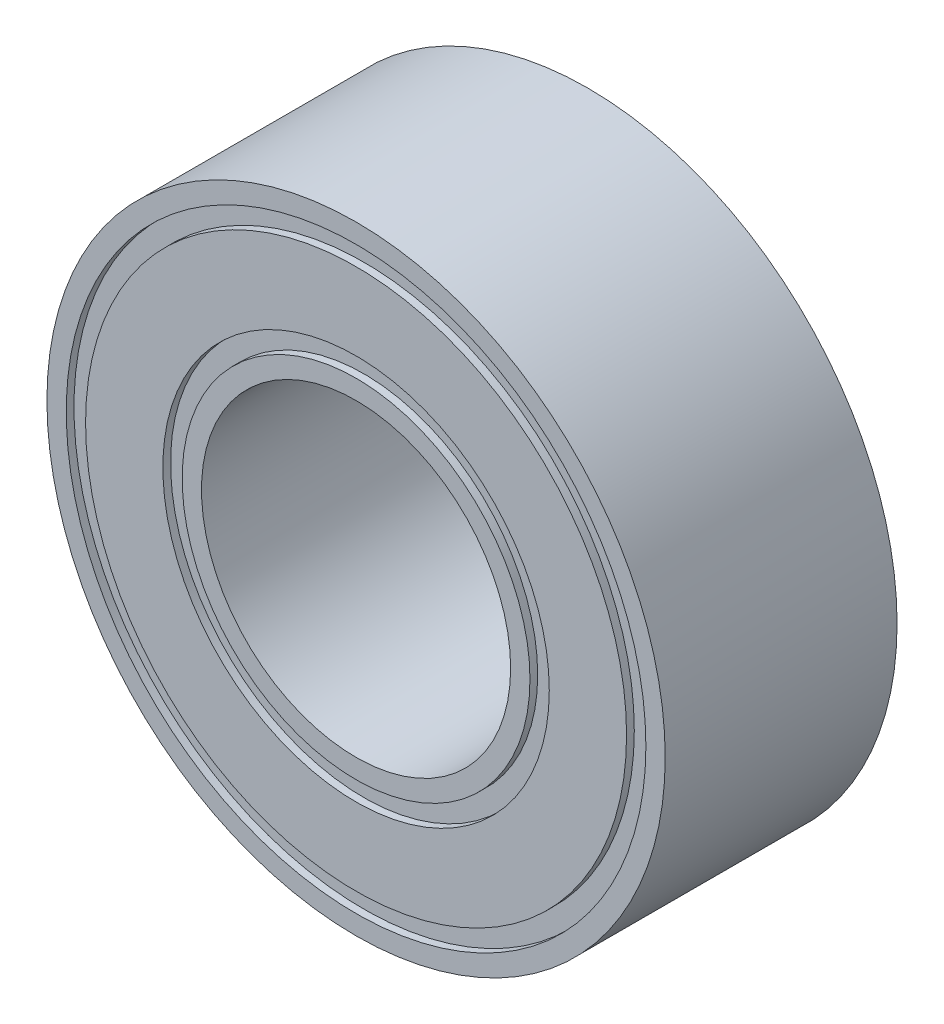
ISO-10303-21;
HEADER;
FILE_DESCRIPTION(('STEP AP214'),'2;1');
FILE_NAME('part.step','',(''),(''),'','','');
FILE_SCHEMA(('AUTOMOTIVE_DESIGN { 1 0 10303 214 1 1 1 1 }'));
ENDSEC;
DATA;
#1=APPLICATION_CONTEXT('core data for automotive mechanical design processes');
#2=APPLICATION_PROTOCOL_DEFINITION('international standard','automotive_design',2000,#1);
#3=PRODUCT_CONTEXT('',#1,'mechanical');
#4=PRODUCT('Part','Part','',(#3));
#5=PRODUCT_RELATED_PRODUCT_CATEGORY('part','',(#4));
#6=PRODUCT_DEFINITION_FORMATION('','',#4);
#7=PRODUCT_DEFINITION_CONTEXT('part definition',#1,'design');
#8=PRODUCT_DEFINITION('design','',#6,#7);
#9=PRODUCT_DEFINITION_SHAPE('','',#8);
#10=(LENGTH_UNIT() NAMED_UNIT(*) SI_UNIT(.MILLI.,.METRE.));
#11=(NAMED_UNIT(*) PLANE_ANGLE_UNIT() SI_UNIT($,.RADIAN.));
#12=(NAMED_UNIT(*) SI_UNIT($,.STERADIAN.) SOLID_ANGLE_UNIT());
#13=UNCERTAINTY_MEASURE_WITH_UNIT(LENGTH_MEASURE(1.E-05),#10,'distance_accuracy_value','');
#14=(GEOMETRIC_REPRESENTATION_CONTEXT(3) GLOBAL_UNCERTAINTY_ASSIGNED_CONTEXT((#13)) GLOBAL_UNIT_ASSIGNED_CONTEXT((#10,
#11,#12)) REPRESENTATION_CONTEXT('',''));
#15=CARTESIAN_POINT('',(0.,0.,0.));
#16=DIRECTION('',(0.,0.,1.));
#17=DIRECTION('',(1.,0.,0.));
#18=AXIS2_PLACEMENT_3D('',#15,#16,#17);
#19=CARTESIAN_POINT('',(0.,0.,0.));
#20=DIRECTION('',(0.,0.,1.));
#21=DIRECTION('',(1.,0.,0.));
#22=AXIS2_PLACEMENT_3D('',#19,#20,#21);
#23=PLANE('',#22);
#24=CARTESIAN_POINT('',(0.,0.,0.));
#25=DIRECTION('',(0.,0.,1.));
#26=DIRECTION('',(1.,0.,0.));
#27=AXIS2_PLACEMENT_3D('',#24,#25,#26);
#28=CIRCLE('',#27,2.);
#29=CARTESIAN_POINT('',(2.,0.,0.));
#30=VERTEX_POINT('',#29);
#31=EDGE_CURVE('E57',#30,#30,#28,.T.);
#32=ORIENTED_EDGE('',*,*,#31,.T.);
#33=EDGE_LOOP('',(#32));
#34=FACE_BOUND('',#33,.T.);
#35=CARTESIAN_POINT('',(0.,0.,0.));
#36=DIRECTION('',(0.,0.,-1.));
#37=DIRECTION('',(-1.,0.,0.));
#38=AXIS2_PLACEMENT_3D('',#35,#36,#37);
#39=CIRCLE('',#38,2.25);
#40=CARTESIAN_POINT('',(-2.25,0.,0.));
#41=VERTEX_POINT('',#40);
#42=EDGE_CURVE('E103',#41,#41,#39,.T.);
#43=ORIENTED_EDGE('',*,*,#42,.T.);
#44=EDGE_LOOP('',(#43));
#45=FACE_BOUND('',#44,.T.);
#46=ADVANCED_FACE('F44',(#34,#45),#23,.F.);
#47=CARTESIAN_POINT('',(0.,0.,0.));
#48=DIRECTION('',(0.,0.,-1.));
#49=DIRECTION('',(-1.,0.,0.));
#50=AXIS2_PLACEMENT_3D('',#47,#48,#49);
#51=CIRCLE('',#50,2.5);
#52=CARTESIAN_POINT('',(-2.5,0.,0.));
#53=VERTEX_POINT('',#52);
#54=EDGE_CURVE('E99',#53,#53,#51,.T.);
#55=ORIENTED_EDGE('',*,*,#54,.F.);
#56=EDGE_LOOP('',(#55));
#57=FACE_BOUND('',#56,.T.);
#58=CARTESIAN_POINT('',(0.,0.,0.));
#59=DIRECTION('',(0.,0.,-1.));
#60=DIRECTION('',(-1.,0.,0.));
#61=AXIS2_PLACEMENT_3D('',#58,#59,#60);
#62=CIRCLE('',#61,3.5);
#63=CARTESIAN_POINT('',(-3.5,0.,0.));
#64=VERTEX_POINT('',#63);
#65=EDGE_CURVE('E91',#64,#64,#62,.T.);
#66=ORIENTED_EDGE('',*,*,#65,.T.);
#67=EDGE_LOOP('',(#66));
#68=FACE_BOUND('',#67,.T.);
#69=ADVANCED_FACE('F126',(#57,#68),#23,.F.);
#70=CARTESIAN_POINT('',(0.,0.,3.));
#71=DIRECTION('',(0.,0.,1.));
#72=DIRECTION('',(1.,0.,0.));
#73=AXIS2_PLACEMENT_3D('',#70,#71,#72);
#74=PLANE('',#73);
#75=CARTESIAN_POINT('',(0.,0.,3.));
#76=DIRECTION('',(0.,0.,1.));
#77=DIRECTION('',(1.,0.,0.));
#78=AXIS2_PLACEMENT_3D('',#75,#76,#77);
#79=CIRCLE('',#78,2.);
#80=CARTESIAN_POINT('',(2.,0.,3.));
#81=VERTEX_POINT('',#80);
#82=EDGE_CURVE('E55',#81,#81,#79,.T.);
#83=ORIENTED_EDGE('',*,*,#82,.F.);
#84=EDGE_LOOP('',(#83));
#85=FACE_BOUND('',#84,.T.);
#86=CARTESIAN_POINT('',(0.,0.,3.));
#87=DIRECTION('',(0.,0.,1.));
#88=DIRECTION('',(1.,0.,0.));
#89=AXIS2_PLACEMENT_3D('',#86,#87,#88);
#90=CIRCLE('',#89,2.25);
#91=CARTESIAN_POINT('',(2.25,0.,3.));
#92=VERTEX_POINT('',#91);
#93=EDGE_CURVE('E79',#92,#92,#90,.T.);
#94=ORIENTED_EDGE('',*,*,#93,.T.);
#95=EDGE_LOOP('',(#94));
#96=FACE_BOUND('',#95,.T.);
#97=ADVANCED_FACE('F129',(#85,#96),#74,.T.);
#98=CARTESIAN_POINT('',(0.,0.,3.));
#99=DIRECTION('',(0.,0.,1.));
#100=DIRECTION('',(1.,0.,0.));
#101=AXIS2_PLACEMENT_3D('',#98,#99,#100);
#102=CIRCLE('',#101,2.5);
#103=CARTESIAN_POINT('',(2.5,0.,3.));
#104=VERTEX_POINT('',#103);
#105=EDGE_CURVE('E75',#104,#104,#102,.T.);
#106=ORIENTED_EDGE('',*,*,#105,.F.);
#107=EDGE_LOOP('',(#106));
#108=FACE_BOUND('',#107,.T.);
#109=CARTESIAN_POINT('',(0.,0.,3.));
#110=DIRECTION('',(0.,0.,1.));
#111=DIRECTION('',(1.,0.,0.));
#112=AXIS2_PLACEMENT_3D('',#109,#110,#111);
#113=CIRCLE('',#112,3.5);
#114=CARTESIAN_POINT('',(3.5,0.,3.));
#115=VERTEX_POINT('',#114);
#116=EDGE_CURVE('E67',#115,#115,#113,.T.);
#117=ORIENTED_EDGE('',*,*,#116,.T.);
#118=EDGE_LOOP('',(#117));
#119=FACE_BOUND('',#118,.T.);
#120=ADVANCED_FACE('F164',(#108,#119),#74,.T.);
#121=CARTESIAN_POINT('',(0.,0.,3.));
#122=DIRECTION('',(0.,0.,1.));
#123=DIRECTION('',(1.,0.,0.));
#124=AXIS2_PLACEMENT_3D('',#121,#122,#123);
#125=CIRCLE('',#124,3.75);
#126=CARTESIAN_POINT('',(3.75,0.,3.));
#127=VERTEX_POINT('',#126);
#128=EDGE_CURVE('E63',#127,#127,#125,.T.);
#129=ORIENTED_EDGE('',*,*,#128,.F.);
#130=EDGE_LOOP('',(#129));
#131=FACE_BOUND('',#130,.T.);
#132=CARTESIAN_POINT('',(0.,0.,3.));
#133=DIRECTION('',(0.,0.,1.));
#134=DIRECTION('',(1.,0.,0.));
#135=AXIS2_PLACEMENT_3D('',#132,#133,#134);
#136=CIRCLE('',#135,4.);
#137=CARTESIAN_POINT('',(4.,0.,3.));
#138=VERTEX_POINT('',#137);
#139=EDGE_CURVE('E11',#138,#138,#136,.T.);
#140=ORIENTED_EDGE('',*,*,#139,.T.);
#141=EDGE_LOOP('',(#140));
#142=FACE_BOUND('',#141,.T.);
#143=ADVANCED_FACE('F156',(#131,#142),#74,.T.);
#144=CARTESIAN_POINT('',(0.,0.,0.));
#145=DIRECTION('',(0.,0.,-1.));
#146=DIRECTION('',(-1.,0.,0.));
#147=AXIS2_PLACEMENT_3D('',#144,#145,#146);
#148=CIRCLE('',#147,3.75);
#149=CARTESIAN_POINT('',(-3.75,0.,0.));
#150=VERTEX_POINT('',#149);
#151=EDGE_CURVE('E87',#150,#150,#148,.T.);
#152=ORIENTED_EDGE('',*,*,#151,.F.);
#153=EDGE_LOOP('',(#152));
#154=FACE_BOUND('',#153,.T.);
#155=CARTESIAN_POINT('',(0.,0.,0.));
#156=DIRECTION('',(0.,0.,1.));
#157=DIRECTION('',(1.,0.,0.));
#158=AXIS2_PLACEMENT_3D('',#155,#156,#157);
#159=CIRCLE('',#158,4.);
#160=CARTESIAN_POINT('',(4.,0.,0.));
#161=VERTEX_POINT('',#160);
#162=EDGE_CURVE('E48',#161,#161,#159,.T.);
#163=ORIENTED_EDGE('',*,*,#162,.F.);
#164=EDGE_LOOP('',(#163));
#165=FACE_BOUND('',#164,.T.);
#166=ADVANCED_FACE('F130',(#154,#165),#23,.F.);
#167=CARTESIAN_POINT('',(0.,0.,3.));
#168=DIRECTION('',(0.,0.,-1.));
#169=DIRECTION('',(-1.,0.,0.));
#170=AXIS2_PLACEMENT_3D('',#167,#168,#169);
#171=CYLINDRICAL_SURFACE('',#170,4.);
#172=ORIENTED_EDGE('',*,*,#139,.F.);
#173=EDGE_LOOP('',(#172));
#174=FACE_BOUND('',#173,.T.);
#175=ORIENTED_EDGE('',*,*,#162,.T.);
#176=EDGE_LOOP('',(#175));
#177=FACE_BOUND('',#176,.T.);
#178=ADVANCED_FACE('F46',(#174,#177),#171,.T.);
#179=CARTESIAN_POINT('',(0.,0.,3.));
#180=DIRECTION('',(0.,0.,-1.));
#181=DIRECTION('',(-1.,0.,0.));
#182=AXIS2_PLACEMENT_3D('',#179,#180,#181);
#183=CYLINDRICAL_SURFACE('',#182,2.);
#184=ORIENTED_EDGE('',*,*,#82,.T.);
#185=EDGE_LOOP('',(#184));
#186=FACE_BOUND('',#185,.T.);
#187=ORIENTED_EDGE('',*,*,#31,.F.);
#188=EDGE_LOOP('',(#187));
#189=FACE_BOUND('',#188,.T.);
#190=ADVANCED_FACE('F162',(#186,#189),#183,.F.);
#191=CARTESIAN_POINT('',(0.,0.,2.9));
#192=DIRECTION('',(0.,0.,1.));
#193=DIRECTION('',(1.,0.,0.));
#194=AXIS2_PLACEMENT_3D('',#191,#192,#193);
#195=CYLINDRICAL_SURFACE('',#194,3.5);
#196=CARTESIAN_POINT('',(0.,0.,2.9));
#197=DIRECTION('',(0.,0.,1.));
#198=DIRECTION('',(1.,0.,0.));
#199=AXIS2_PLACEMENT_3D('',#196,#197,#198);
#200=CIRCLE('',#199,3.5);
#201=CARTESIAN_POINT('',(3.5,0.,2.9));
#202=VERTEX_POINT('',#201);
#203=EDGE_CURVE('E66',#202,#202,#200,.T.);
#204=ORIENTED_EDGE('',*,*,#203,.T.);
#205=EDGE_LOOP('',(#204));
#206=FACE_BOUND('',#205,.T.);
#207=ORIENTED_EDGE('',*,*,#116,.F.);
#208=EDGE_LOOP('',(#207));
#209=FACE_BOUND('',#208,.T.);
#210=ADVANCED_FACE('F202',(#206,#209),#195,.T.);
#211=CARTESIAN_POINT('',(0.,0.,2.9));
#212=DIRECTION('',(0.,0.,1.));
#213=DIRECTION('',(1.,0.,0.));
#214=AXIS2_PLACEMENT_3D('',#211,#212,#213);
#215=CYLINDRICAL_SURFACE('',#214,3.75);
#216=CARTESIAN_POINT('',(0.,0.,2.9));
#217=DIRECTION('',(0.,0.,1.));
#218=DIRECTION('',(1.,0.,0.));
#219=AXIS2_PLACEMENT_3D('',#216,#217,#218);
#220=CIRCLE('',#219,3.75);
#221=CARTESIAN_POINT('',(3.75,0.,2.9));
#222=VERTEX_POINT('',#221);
#223=EDGE_CURVE('E60',#222,#222,#220,.T.);
#224=ORIENTED_EDGE('',*,*,#223,.F.);
#225=EDGE_LOOP('',(#224));
#226=FACE_BOUND('',#225,.T.);
#227=ORIENTED_EDGE('',*,*,#128,.T.);
#228=EDGE_LOOP('',(#227));
#229=FACE_BOUND('',#228,.T.);
#230=ADVANCED_FACE('F196',(#226,#229),#215,.F.);
#231=CARTESIAN_POINT('',(0.,0.,2.9));
#232=DIRECTION('',(0.,0.,1.));
#233=DIRECTION('',(1.,0.,0.));
#234=AXIS2_PLACEMENT_3D('',#231,#232,#233);
#235=PLANE('',#234);
#236=ORIENTED_EDGE('',*,*,#203,.F.);
#237=EDGE_LOOP('',(#236));
#238=FACE_BOUND('',#237,.T.);
#239=ORIENTED_EDGE('',*,*,#223,.T.);
#240=EDGE_LOOP('',(#239));
#241=FACE_BOUND('',#240,.T.);
#242=ADVANCED_FACE('F187',(#238,#241),#235,.T.);
#243=CARTESIAN_POINT('',(0.,0.,2.9));
#244=DIRECTION('',(0.,0.,1.));
#245=DIRECTION('',(1.,0.,0.));
#246=AXIS2_PLACEMENT_3D('',#243,#244,#245);
#247=CYLINDRICAL_SURFACE('',#246,2.25);
#248=CARTESIAN_POINT('',(0.,0.,2.9));
#249=DIRECTION('',(0.,0.,1.));
#250=DIRECTION('',(1.,0.,0.));
#251=AXIS2_PLACEMENT_3D('',#248,#249,#250);
#252=CIRCLE('',#251,2.25);
#253=CARTESIAN_POINT('',(2.25,0.,2.9));
#254=VERTEX_POINT('',#253);
#255=EDGE_CURVE('E78',#254,#254,#252,.T.);
#256=ORIENTED_EDGE('',*,*,#255,.T.);
#257=EDGE_LOOP('',(#256));
#258=FACE_BOUND('',#257,.T.);
#259=ORIENTED_EDGE('',*,*,#93,.F.);
#260=EDGE_LOOP('',(#259));
#261=FACE_BOUND('',#260,.T.);
#262=ADVANCED_FACE('F185',(#258,#261),#247,.T.);
#263=CARTESIAN_POINT('',(0.,0.,2.9));
#264=DIRECTION('',(0.,0.,1.));
#265=DIRECTION('',(1.,0.,0.));
#266=AXIS2_PLACEMENT_3D('',#263,#264,#265);
#267=CYLINDRICAL_SURFACE('',#266,2.5);
#268=CARTESIAN_POINT('',(0.,0.,2.9));
#269=DIRECTION('',(0.,0.,1.));
#270=DIRECTION('',(1.,0.,0.));
#271=AXIS2_PLACEMENT_3D('',#268,#269,#270);
#272=CIRCLE('',#271,2.5);
#273=CARTESIAN_POINT('',(2.5,0.,2.9));
#274=VERTEX_POINT('',#273);
#275=EDGE_CURVE('E70',#274,#274,#272,.T.);
#276=ORIENTED_EDGE('',*,*,#275,.F.);
#277=EDGE_LOOP('',(#276));
#278=FACE_BOUND('',#277,.T.);
#279=ORIENTED_EDGE('',*,*,#105,.T.);
#280=EDGE_LOOP('',(#279));
#281=FACE_BOUND('',#280,.T.);
#282=ADVANCED_FACE('F146',(#278,#281),#267,.F.);
#283=CARTESIAN_POINT('',(0.,0.,2.9));
#284=DIRECTION('',(0.,0.,1.));
#285=DIRECTION('',(1.,0.,0.));
#286=AXIS2_PLACEMENT_3D('',#283,#284,#285);
#287=PLANE('',#286);
#288=ORIENTED_EDGE('',*,*,#255,.F.);
#289=EDGE_LOOP('',(#288));
#290=FACE_BOUND('',#289,.T.);
#291=ORIENTED_EDGE('',*,*,#275,.T.);
#292=EDGE_LOOP('',(#291));
#293=FACE_BOUND('',#292,.T.);
#294=ADVANCED_FACE('F136',(#290,#293),#287,.T.);
#295=CARTESIAN_POINT('',(0.,0.,0.1));
#296=DIRECTION('',(0.,0.,-1.));
#297=DIRECTION('',(-1.,0.,0.));
#298=AXIS2_PLACEMENT_3D('',#295,#296,#297);
#299=CYLINDRICAL_SURFACE('',#298,3.5);
#300=CARTESIAN_POINT('',(0.,0.,0.1));
#301=DIRECTION('',(0.,0.,-1.));
#302=DIRECTION('',(-1.,0.,0.));
#303=AXIS2_PLACEMENT_3D('',#300,#301,#302);
#304=CIRCLE('',#303,3.5);
#305=CARTESIAN_POINT('',(-3.5,0.,0.1));
#306=VERTEX_POINT('',#305);
#307=EDGE_CURVE('E90',#306,#306,#304,.T.);
#308=ORIENTED_EDGE('',*,*,#307,.T.);
#309=EDGE_LOOP('',(#308));
#310=FACE_BOUND('',#309,.T.);
#311=ORIENTED_EDGE('',*,*,#65,.F.);
#312=EDGE_LOOP('',(#311));
#313=FACE_BOUND('',#312,.T.);
#314=ADVANCED_FACE('F133',(#310,#313),#299,.T.);
#315=CARTESIAN_POINT('',(0.,0.,0.1));
#316=DIRECTION('',(0.,0.,-1.));
#317=DIRECTION('',(-1.,0.,0.));
#318=AXIS2_PLACEMENT_3D('',#315,#316,#317);
#319=CYLINDRICAL_SURFACE('',#318,3.75);
#320=CARTESIAN_POINT('',(0.,0.,0.1));
#321=DIRECTION('',(0.,0.,-1.));
#322=DIRECTION('',(-1.,0.,0.));
#323=AXIS2_PLACEMENT_3D('',#320,#321,#322);
#324=CIRCLE('',#323,3.75);
#325=CARTESIAN_POINT('',(-3.75,0.,0.1));
#326=VERTEX_POINT('',#325);
#327=EDGE_CURVE('E82',#326,#326,#324,.T.);
#328=ORIENTED_EDGE('',*,*,#327,.F.);
#329=EDGE_LOOP('',(#328));
#330=FACE_BOUND('',#329,.T.);
#331=ORIENTED_EDGE('',*,*,#151,.T.);
#332=EDGE_LOOP('',(#331));
#333=FACE_BOUND('',#332,.T.);
#334=ADVANCED_FACE('F135',(#330,#333),#319,.F.);
#335=CARTESIAN_POINT('',(0.,0.,0.1));
#336=DIRECTION('',(0.,0.,-1.));
#337=DIRECTION('',(-1.,0.,0.));
#338=AXIS2_PLACEMENT_3D('',#335,#336,#337);
#339=PLANE('',#338);
#340=ORIENTED_EDGE('',*,*,#307,.F.);
#341=EDGE_LOOP('',(#340));
#342=FACE_BOUND('',#341,.T.);
#343=ORIENTED_EDGE('',*,*,#327,.T.);
#344=EDGE_LOOP('',(#343));
#345=FACE_BOUND('',#344,.T.);
#346=ADVANCED_FACE('F143',(#342,#345),#339,.T.);
#347=CARTESIAN_POINT('',(0.,0.,0.1));
#348=DIRECTION('',(0.,0.,-1.));
#349=DIRECTION('',(-1.,0.,0.));
#350=AXIS2_PLACEMENT_3D('',#347,#348,#349);
#351=CYLINDRICAL_SURFACE('',#350,2.25);
#352=CARTESIAN_POINT('',(0.,0.,0.1));
#353=DIRECTION('',(0.,0.,-1.));
#354=DIRECTION('',(-1.,0.,0.));
#355=AXIS2_PLACEMENT_3D('',#352,#353,#354);
#356=CIRCLE('',#355,2.25);
#357=CARTESIAN_POINT('',(-2.25,0.,0.1));
#358=VERTEX_POINT('',#357);
#359=EDGE_CURVE('E102',#358,#358,#356,.T.);
#360=ORIENTED_EDGE('',*,*,#359,.T.);
#361=EDGE_LOOP('',(#360));
#362=FACE_BOUND('',#361,.T.);
#363=ORIENTED_EDGE('',*,*,#42,.F.);
#364=EDGE_LOOP('',(#363));
#365=FACE_BOUND('',#364,.T.);
#366=ADVANCED_FACE('F111',(#362,#365),#351,.T.);
#367=CARTESIAN_POINT('',(0.,0.,0.1));
#368=DIRECTION('',(0.,0.,-1.));
#369=DIRECTION('',(-1.,0.,0.));
#370=AXIS2_PLACEMENT_3D('',#367,#368,#369);
#371=CYLINDRICAL_SURFACE('',#370,2.5);
#372=CARTESIAN_POINT('',(0.,0.,0.1));
#373=DIRECTION('',(0.,0.,-1.));
#374=DIRECTION('',(-1.,0.,0.));
#375=AXIS2_PLACEMENT_3D('',#372,#373,#374);
#376=CIRCLE('',#375,2.5);
#377=CARTESIAN_POINT('',(-2.5,0.,0.1));
#378=VERTEX_POINT('',#377);
#379=EDGE_CURVE('E94',#378,#378,#376,.T.);
#380=ORIENTED_EDGE('',*,*,#379,.F.);
#381=EDGE_LOOP('',(#380));
#382=FACE_BOUND('',#381,.T.);
#383=ORIENTED_EDGE('',*,*,#54,.T.);
#384=EDGE_LOOP('',(#383));
#385=FACE_BOUND('',#384,.T.);
#386=ADVANCED_FACE('F117',(#382,#385),#371,.F.);
#387=CARTESIAN_POINT('',(0.,0.,0.1));
#388=DIRECTION('',(0.,0.,-1.));
#389=DIRECTION('',(-1.,0.,0.));
#390=AXIS2_PLACEMENT_3D('',#387,#388,#389);
#391=PLANE('',#390);
#392=ORIENTED_EDGE('',*,*,#359,.F.);
#393=EDGE_LOOP('',(#392));
#394=FACE_BOUND('',#393,.T.);
#395=ORIENTED_EDGE('',*,*,#379,.T.);
#396=EDGE_LOOP('',(#395));
#397=FACE_BOUND('',#396,.T.);
#398=ADVANCED_FACE('F114',(#394,#397),#391,.T.);
#399=CLOSED_SHELL('',(#46,#69,#97,#120,#143,#166,#178,#190,#210,#230,#242,#262,#282,#294,#314,
#334,#346,#366,#386,#398));
#400=MANIFOLD_SOLID_BREP('B2',#399);
#401=ADVANCED_BREP_SHAPE_REPRESENTATION('',(#18,#400),#14);
#402=SHAPE_DEFINITION_REPRESENTATION(#9,#401);
ENDSEC;
END-ISO-10303-21;
